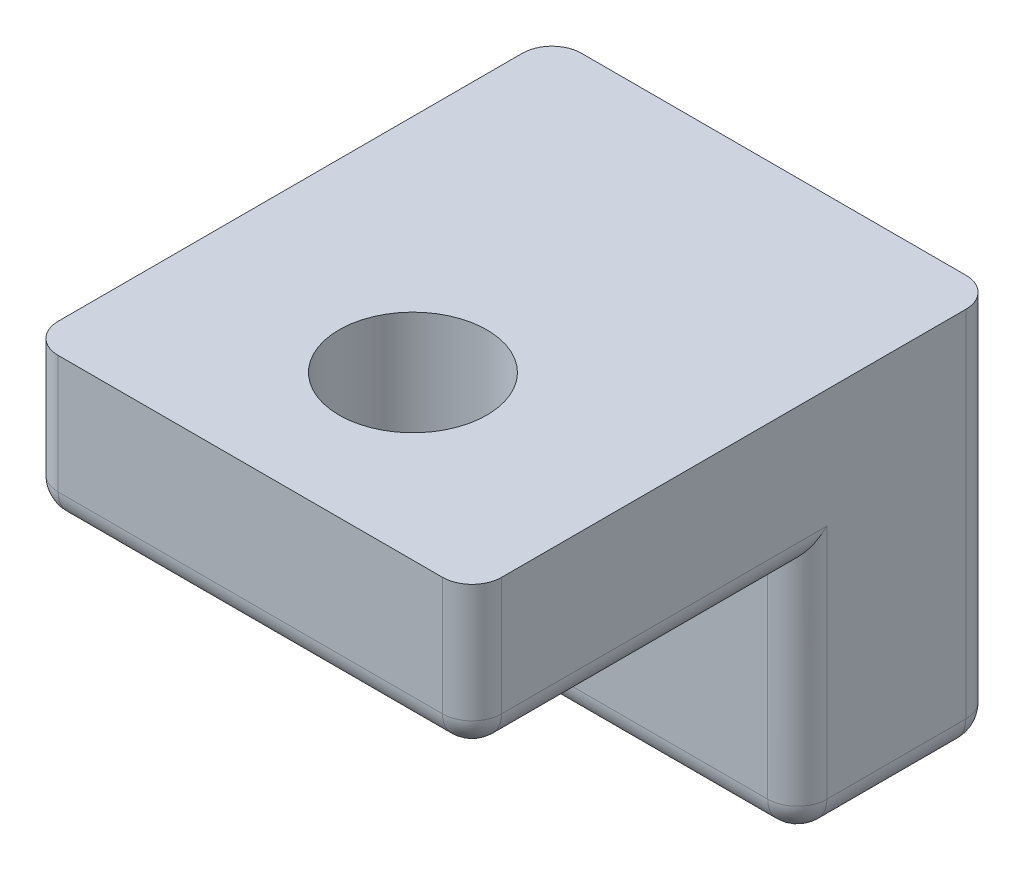
ISO-10303-21;
HEADER;
FILE_DESCRIPTION(('STEP AP214'),'2;1');
FILE_NAME('part.step','',(''),(''),'','','');
FILE_SCHEMA(('AUTOMOTIVE_DESIGN { 1 0 10303 214 1 1 1 1 }'));
ENDSEC;
DATA;
#1=APPLICATION_CONTEXT('core data for automotive mechanical design processes');
#2=APPLICATION_PROTOCOL_DEFINITION('international standard','automotive_design',2000,#1);
#3=PRODUCT_CONTEXT('',#1,'mechanical');
#4=PRODUCT('Part','Part','',(#3));
#5=PRODUCT_RELATED_PRODUCT_CATEGORY('part','',(#4));
#6=PRODUCT_DEFINITION_FORMATION('','',#4);
#7=PRODUCT_DEFINITION_CONTEXT('part definition',#1,'design');
#8=PRODUCT_DEFINITION('design','',#6,#7);
#9=PRODUCT_DEFINITION_SHAPE('','',#8);
#10=(LENGTH_UNIT() NAMED_UNIT(*) SI_UNIT(.MILLI.,.METRE.));
#11=(NAMED_UNIT(*) PLANE_ANGLE_UNIT() SI_UNIT($,.RADIAN.));
#12=(NAMED_UNIT(*) SI_UNIT($,.STERADIAN.) SOLID_ANGLE_UNIT());
#13=UNCERTAINTY_MEASURE_WITH_UNIT(LENGTH_MEASURE(1.E-05),#10,'distance_accuracy_value','');
#14=(GEOMETRIC_REPRESENTATION_CONTEXT(3) GLOBAL_UNCERTAINTY_ASSIGNED_CONTEXT((#13)) GLOBAL_UNIT_ASSIGNED_CONTEXT((#10,
#11,#12)) REPRESENTATION_CONTEXT('',''));
#15=CARTESIAN_POINT('',(0.,0.,0.));
#16=DIRECTION('',(0.,0.,1.));
#17=DIRECTION('',(1.,0.,0.));
#18=AXIS2_PLACEMENT_3D('',#15,#16,#17);
#19=CARTESIAN_POINT('',(7.5,0.,-6.70000000000001));
#20=DIRECTION('',(0.,1.,0.));
#21=DIRECTION('',(0.,0.,1.));
#22=AXIS2_PLACEMENT_3D('',#19,#20,#21);
#23=PLANE('',#22);
#24=DIRECTION('',(0.,0.,-1.));
#25=VECTOR('',#24,1.);
#26=CARTESIAN_POINT('',(6.5,0.,-6.70000000000001));
#27=LINE('',#26,#25);
#28=CARTESIAN_POINT('',(6.5,0.,-5.70000000000001));
#29=VERTEX_POINT('',#28);
#30=CARTESIAN_POINT('',(6.5,0.,-0.999999999999997));
#31=VERTEX_POINT('',#30);
#32=EDGE_CURVE('E183',#29,#31,#27,.F.);
#33=ORIENTED_EDGE('',*,*,#32,.T.);
#34=DIRECTION('',(-1.,0.,0.));
#35=VECTOR('',#34,1.);
#36=CARTESIAN_POINT('',(7.5,0.,-0.999999999999997));
#37=LINE('',#36,#35);
#38=CARTESIAN_POINT('',(-6.5,0.,-0.999999999999997));
#39=VERTEX_POINT('',#38);
#40=EDGE_CURVE('E152',#31,#39,#37,.T.);
#41=ORIENTED_EDGE('',*,*,#40,.T.);
#42=DIRECTION('',(0.,0.,-1.));
#43=VECTOR('',#42,1.);
#44=CARTESIAN_POINT('',(-6.5,0.,-6.70000000000001));
#45=LINE('',#44,#43);
#46=CARTESIAN_POINT('',(-6.5,0.,-5.70000000000001));
#47=VERTEX_POINT('',#46);
#48=EDGE_CURVE('E172',#39,#47,#45,.T.);
#49=ORIENTED_EDGE('',*,*,#48,.T.);
#50=DIRECTION('',(-1.,0.,0.));
#51=VECTOR('',#50,1.);
#52=CARTESIAN_POINT('',(7.5,0.,-5.70000000000001));
#53=LINE('',#52,#51);
#54=EDGE_CURVE('E179',#47,#29,#53,.F.);
#55=ORIENTED_EDGE('',*,*,#54,.T.);
#56=EDGE_LOOP('',(#33,#41,#49,#55));
#57=FACE_BOUND('',#56,.T.);
#58=ADVANCED_FACE('F39',(#57),#23,.F.);
#59=CARTESIAN_POINT('',(7.5,13.,-6.7));
#60=DIRECTION('',(0.,0.,1.));
#61=DIRECTION('',(0.,-1.,0.));
#62=AXIS2_PLACEMENT_3D('',#59,#60,#61);
#63=PLANE('',#62);
#64=DIRECTION('',(-1.,0.,0.));
#65=VECTOR('',#64,1.);
#66=CARTESIAN_POINT('',(7.5,0.999999999999984,-6.70000000000001));
#67=LINE('',#66,#65);
#68=CARTESIAN_POINT('',(6.5,0.999999999999984,-6.70000000000001));
#69=VERTEX_POINT('',#68);
#70=CARTESIAN_POINT('',(-6.5,0.999999999999984,-6.70000000000001));
#71=VERTEX_POINT('',#70);
#72=EDGE_CURVE('E218',#69,#71,#67,.T.);
#73=ORIENTED_EDGE('',*,*,#72,.T.);
#74=DIRECTION('',(0.,1.,0.));
#75=VECTOR('',#74,1.);
#76=CARTESIAN_POINT('',(-6.5,13.,-6.7));
#77=LINE('',#76,#75);
#78=CARTESIAN_POINT('',(-6.5,13.,-6.7));
#79=VERTEX_POINT('',#78);
#80=EDGE_CURVE('E221',#71,#79,#77,.T.);
#81=ORIENTED_EDGE('',*,*,#80,.T.);
#82=DIRECTION('',(-1.,0.,0.));
#83=VECTOR('',#82,1.);
#84=CARTESIAN_POINT('',(7.5,13.,-6.7));
#85=LINE('',#84,#83);
#86=CARTESIAN_POINT('',(6.5,13.,-6.7));
#87=VERTEX_POINT('',#86);
#88=EDGE_CURVE('E180',#87,#79,#85,.T.);
#89=ORIENTED_EDGE('',*,*,#88,.F.);
#90=DIRECTION('',(0.,1.,0.));
#91=VECTOR('',#90,1.);
#92=CARTESIAN_POINT('',(6.5,13.,-6.7));
#93=LINE('',#92,#91);
#94=EDGE_CURVE('E215',#87,#69,#93,.F.);
#95=ORIENTED_EDGE('',*,*,#94,.T.);
#96=EDGE_LOOP('',(#73,#81,#89,#95));
#97=FACE_BOUND('',#96,.T.);
#98=ADVANCED_FACE('F424',(#97),#63,.F.);
#99=CARTESIAN_POINT('',(7.5,13.,11.));
#100=DIRECTION('',(0.,-1.,0.));
#101=DIRECTION('',(0.,0.,-1.));
#102=AXIS2_PLACEMENT_3D('',#99,#100,#101);
#103=PLANE('',#102);
#104=CARTESIAN_POINT('',(0.,13.,5.50000000000001));
#105=DIRECTION('',(0.,1.,0.));
#106=DIRECTION('',(0.,0.,1.));
#107=AXIS2_PLACEMENT_3D('',#104,#105,#106);
#108=CIRCLE('',#107,2.5);
#109=CARTESIAN_POINT('',(0.,13.,8.00000000000001));
#110=VERTEX_POINT('',#109);
#111=EDGE_CURVE('E326',#110,#110,#108,.T.);
#112=ORIENTED_EDGE('',*,*,#111,.F.);
#113=EDGE_LOOP('',(#112));
#114=FACE_BOUND('',#113,.T.);
#115=ORIENTED_EDGE('',*,*,#88,.T.);
#116=CARTESIAN_POINT('',(-6.5,13.,-5.7));
#117=DIRECTION('',(0.,-1.,0.));
#118=DIRECTION('',(0.,0.,-1.));
#119=AXIS2_PLACEMENT_3D('',#116,#117,#118);
#120=CIRCLE('',#119,1.);
#121=CARTESIAN_POINT('',(-7.5,13.,-5.7));
#122=VERTEX_POINT('',#121);
#123=EDGE_CURVE('E11',#79,#122,#120,.F.);
#124=ORIENTED_EDGE('',*,*,#123,.T.);
#125=DIRECTION('',(0.,0.,1.));
#126=VECTOR('',#125,1.);
#127=CARTESIAN_POINT('',(-7.5,13.,11.));
#128=LINE('',#127,#126);
#129=CARTESIAN_POINT('',(-7.5,13.,10.));
#130=VERTEX_POINT('',#129);
#131=EDGE_CURVE('E336',#122,#130,#128,.T.);
#132=ORIENTED_EDGE('',*,*,#131,.T.);
#133=CARTESIAN_POINT('',(-6.5,13.,10.));
#134=DIRECTION('',(0.,-1.,0.));
#135=DIRECTION('',(0.,0.,-1.));
#136=AXIS2_PLACEMENT_3D('',#133,#134,#135);
#137=CIRCLE('',#136,1.);
#138=CARTESIAN_POINT('',(-6.5,13.,11.));
#139=VERTEX_POINT('',#138);
#140=EDGE_CURVE('E49',#130,#139,#137,.F.);
#141=ORIENTED_EDGE('',*,*,#140,.T.);
#142=DIRECTION('',(-1.,0.,0.));
#143=VECTOR('',#142,1.);
#144=CARTESIAN_POINT('',(7.5,13.,11.));
#145=LINE('',#144,#143);
#146=CARTESIAN_POINT('',(6.5,13.,11.));
#147=VERTEX_POINT('',#146);
#148=EDGE_CURVE('E350',#147,#139,#145,.T.);
#149=ORIENTED_EDGE('',*,*,#148,.F.);
#150=CARTESIAN_POINT('',(6.5,13.,10.));
#151=DIRECTION('',(0.,-1.,0.));
#152=DIRECTION('',(0.,0.,-1.));
#153=AXIS2_PLACEMENT_3D('',#150,#151,#152);
#154=CIRCLE('',#153,1.);
#155=CARTESIAN_POINT('',(7.5,13.,10.));
#156=VERTEX_POINT('',#155);
#157=EDGE_CURVE('E258',#147,#156,#154,.F.);
#158=ORIENTED_EDGE('',*,*,#157,.T.);
#159=DIRECTION('',(0.,0.,1.));
#160=VECTOR('',#159,1.);
#161=CARTESIAN_POINT('',(7.5,13.,11.));
#162=LINE('',#161,#160);
#163=CARTESIAN_POINT('',(7.5,13.,-5.7));
#164=VERTEX_POINT('',#163);
#165=EDGE_CURVE('E339',#164,#156,#162,.T.);
#166=ORIENTED_EDGE('',*,*,#165,.F.);
#167=CARTESIAN_POINT('',(6.5,13.,-5.7));
#168=DIRECTION('',(0.,-1.,0.));
#169=DIRECTION('',(0.,0.,-1.));
#170=AXIS2_PLACEMENT_3D('',#167,#168,#169);
#171=CIRCLE('',#170,1.);
#172=EDGE_CURVE('E255',#164,#87,#171,.F.);
#173=ORIENTED_EDGE('',*,*,#172,.T.);
#174=EDGE_LOOP('',(#115,#124,#132,#141,#149,#158,#166,#173));
#175=FACE_BOUND('',#174,.T.);
#176=ADVANCED_FACE('F404',(#114,#175),#103,.F.);
#177=CARTESIAN_POINT('',(7.5,8.00000000000001,10.9999999999999));
#178=DIRECTION('',(0.,0.,-1.));
#179=DIRECTION('',(0.,1.,0.));
#180=AXIS2_PLACEMENT_3D('',#177,#178,#179);
#181=PLANE('',#180);
#182=ORIENTED_EDGE('',*,*,#148,.T.);
#183=DIRECTION('',(0.,-1.,0.));
#184=VECTOR('',#183,1.);
#185=CARTESIAN_POINT('',(-6.5,8.00000000000001,10.9999999999999));
#186=LINE('',#185,#184);
#187=CARTESIAN_POINT('',(-6.5,8.99999999999999,10.9999999999999));
#188=VERTEX_POINT('',#187);
#189=EDGE_CURVE('E57',#139,#188,#186,.T.);
#190=ORIENTED_EDGE('',*,*,#189,.T.);
#191=DIRECTION('',(-1.,0.,0.));
#192=VECTOR('',#191,1.);
#193=CARTESIAN_POINT('',(7.5,8.99999999999999,10.9999999999999));
#194=LINE('',#193,#192);
#195=CARTESIAN_POINT('',(6.5,8.99999999999999,10.9999999999999));
#196=VERTEX_POINT('',#195);
#197=EDGE_CURVE('E61',#188,#196,#194,.F.);
#198=ORIENTED_EDGE('',*,*,#197,.T.);
#199=DIRECTION('',(0.,-1.,0.));
#200=VECTOR('',#199,1.);
#201=CARTESIAN_POINT('',(6.5,8.00000000000001,10.9999999999999));
#202=LINE('',#201,#200);
#203=EDGE_CURVE('E248',#196,#147,#202,.F.);
#204=ORIENTED_EDGE('',*,*,#203,.T.);
#205=EDGE_LOOP('',(#182,#190,#198,#204));
#206=FACE_BOUND('',#205,.T.);
#207=ADVANCED_FACE('F609',(#206),#181,.F.);
#208=CARTESIAN_POINT('',(7.5,8.00000000000001,0.));
#209=DIRECTION('',(0.,1.,0.));
#210=DIRECTION('',(0.,0.,1.));
#211=AXIS2_PLACEMENT_3D('',#208,#209,#210);
#212=PLANE('',#211);
#213=CARTESIAN_POINT('',(0.,8.00000000000001,5.50000000000001));
#214=DIRECTION('',(0.,1.,0.));
#215=DIRECTION('',(0.,0.,1.));
#216=AXIS2_PLACEMENT_3D('',#213,#214,#215);
#217=CIRCLE('',#216,2.5);
#218=CARTESIAN_POINT('',(0.,8.00000000000001,8.00000000000001));
#219=VERTEX_POINT('',#218);
#220=EDGE_CURVE('E330',#219,#219,#217,.F.);
#221=ORIENTED_EDGE('',*,*,#220,.F.);
#222=EDGE_LOOP('',(#221));
#223=FACE_BOUND('',#222,.T.);
#224=DIRECTION('',(-1.,0.,0.));
#225=VECTOR('',#224,1.);
#226=CARTESIAN_POINT('',(7.5,8.00000000000001,9.99999999999994));
#227=LINE('',#226,#225);
#228=CARTESIAN_POINT('',(6.5,8.00000000000001,9.99999999999994));
#229=VERTEX_POINT('',#228);
#230=CARTESIAN_POINT('',(-6.5,8.00000000000001,9.99999999999994));
#231=VERTEX_POINT('',#230);
#232=EDGE_CURVE('E242',#229,#231,#227,.T.);
#233=ORIENTED_EDGE('',*,*,#232,.T.);
#234=DIRECTION('',(0.,0.,-1.));
#235=VECTOR('',#234,1.);
#236=CARTESIAN_POINT('',(-6.5,8.00000000000001,0.));
#237=LINE('',#236,#235);
#238=CARTESIAN_POINT('',(-6.5,8.00000000000001,0.));
#239=VERTEX_POINT('',#238);
#240=EDGE_CURVE('E245',#231,#239,#237,.T.);
#241=ORIENTED_EDGE('',*,*,#240,.T.);
#242=DIRECTION('',(-1.,0.,0.));
#243=VECTOR('',#242,1.);
#244=CARTESIAN_POINT('',(7.5,8.00000000000001,0.));
#245=LINE('',#244,#243);
#246=CARTESIAN_POINT('',(6.5,8.00000000000001,0.));
#247=VERTEX_POINT('',#246);
#248=EDGE_CURVE('E343',#247,#239,#245,.T.);
#249=ORIENTED_EDGE('',*,*,#248,.F.);
#250=DIRECTION('',(0.,0.,-1.));
#251=VECTOR('',#250,1.);
#252=CARTESIAN_POINT('',(6.5,8.00000000000001,0.));
#253=LINE('',#252,#251);
#254=EDGE_CURVE('E239',#247,#229,#253,.F.);
#255=ORIENTED_EDGE('',*,*,#254,.T.);
#256=EDGE_LOOP('',(#233,#241,#249,#255));
#257=FACE_BOUND('',#256,.T.);
#258=ADVANCED_FACE('F601',(#223,#257),#212,.F.);
#259=CARTESIAN_POINT('',(7.5,0.,0.));
#260=DIRECTION('',(0.,0.,-1.));
#261=DIRECTION('',(0.,1.,0.));
#262=AXIS2_PLACEMENT_3D('',#259,#260,#261);
#263=PLANE('',#262);
#264=DIRECTION('',(-1.,0.,0.));
#265=VECTOR('',#264,1.);
#266=CARTESIAN_POINT('',(7.5,0.999999999999997,0.));
#267=LINE('',#266,#265);
#268=CARTESIAN_POINT('',(-6.5,0.999999999999997,0.));
#269=VERTEX_POINT('',#268);
#270=CARTESIAN_POINT('',(6.5,0.999999999999997,0.));
#271=VERTEX_POINT('',#270);
#272=EDGE_CURVE('E154',#269,#271,#267,.F.);
#273=ORIENTED_EDGE('',*,*,#272,.T.);
#274=DIRECTION('',(0.,-1.,0.));
#275=VECTOR('',#274,1.);
#276=CARTESIAN_POINT('',(6.5,0.,0.));
#277=LINE('',#276,#275);
#278=EDGE_CURVE('E196',#271,#247,#277,.F.);
#279=ORIENTED_EDGE('',*,*,#278,.T.);
#280=ORIENTED_EDGE('',*,*,#248,.T.);
#281=DIRECTION('',(0.,-1.,0.));
#282=VECTOR('',#281,1.);
#283=CARTESIAN_POINT('',(-6.5,0.,0.));
#284=LINE('',#283,#282);
#285=EDGE_CURVE('E186',#239,#269,#284,.T.);
#286=ORIENTED_EDGE('',*,*,#285,.T.);
#287=EDGE_LOOP('',(#273,#279,#280,#286));
#288=FACE_BOUND('',#287,.T.);
#289=ADVANCED_FACE('F380',(#288),#263,.F.);
#290=CARTESIAN_POINT('',(7.5,0.,0.));
#291=DIRECTION('',(-1.,0.,0.));
#292=DIRECTION('',(0.,0.,1.));
#293=AXIS2_PLACEMENT_3D('',#290,#291,#292);
#294=PLANE('',#293);
#295=ORIENTED_EDGE('',*,*,#165,.T.);
#296=DIRECTION('',(0.,-1.,0.));
#297=VECTOR('',#296,1.);
#298=CARTESIAN_POINT('',(7.5,-1.45716771982049E-13,9.99999999999981));
#299=LINE('',#298,#297);
#300=CARTESIAN_POINT('',(7.5,9.00000000000001,9.99999999999994));
#301=VERTEX_POINT('',#300);
#302=EDGE_CURVE('E212',#156,#301,#299,.T.);
#303=ORIENTED_EDGE('',*,*,#302,.T.);
#304=DIRECTION('',(0.,0.,-1.));
#305=VECTOR('',#304,1.);
#306=CARTESIAN_POINT('',(7.5,9.00000000000001,0.));
#307=LINE('',#306,#305);
#308=CARTESIAN_POINT('',(7.5,9.00000000000001,-0.999999999999997));
#309=VERTEX_POINT('',#308);
#310=EDGE_CURVE('E209',#301,#309,#307,.T.);
#311=ORIENTED_EDGE('',*,*,#310,.T.);
#312=DIRECTION('',(0.,-1.,0.));
#313=VECTOR('',#312,1.);
#314=CARTESIAN_POINT('',(7.5,0.,-1.));
#315=LINE('',#314,#313);
#316=CARTESIAN_POINT('',(7.5,0.999999999999997,-1.));
#317=VERTEX_POINT('',#316);
#318=EDGE_CURVE('E206',#309,#317,#315,.T.);
#319=ORIENTED_EDGE('',*,*,#318,.T.);
#320=DIRECTION('',(0.,0.,-1.));
#321=VECTOR('',#320,1.);
#322=CARTESIAN_POINT('',(7.5,1.,0.));
#323=LINE('',#322,#321);
#324=CARTESIAN_POINT('',(7.5,0.999999999999983,-5.70000000000001));
#325=VERTEX_POINT('',#324);
#326=EDGE_CURVE('E202',#317,#325,#323,.T.);
#327=ORIENTED_EDGE('',*,*,#326,.T.);
#328=DIRECTION('',(0.,1.,0.));
#329=VECTOR('',#328,1.);
#330=CARTESIAN_POINT('',(7.5,0.,-5.70000000000001));
#331=LINE('',#330,#329);
#332=EDGE_CURVE('E199',#325,#164,#331,.T.);
#333=ORIENTED_EDGE('',*,*,#332,.T.);
#334=EDGE_LOOP('',(#295,#303,#311,#319,#327,#333));
#335=FACE_BOUND('',#334,.T.);
#336=ADVANCED_FACE('F585',(#335),#294,.F.);
#337=CARTESIAN_POINT('',(-7.5,0.,0.));
#338=DIRECTION('',(-1.,0.,0.));
#339=DIRECTION('',(0.,0.,1.));
#340=AXIS2_PLACEMENT_3D('',#337,#338,#339);
#341=PLANE('',#340);
#342=ORIENTED_EDGE('',*,*,#131,.F.);
#343=DIRECTION('',(0.,1.,0.));
#344=VECTOR('',#343,1.);
#345=CARTESIAN_POINT('',(-7.5,0.,-5.70000000000001));
#346=LINE('',#345,#344);
#347=CARTESIAN_POINT('',(-7.5,0.999999999999983,-5.70000000000001));
#348=VERTEX_POINT('',#347);
#349=EDGE_CURVE('E236',#122,#348,#346,.F.);
#350=ORIENTED_EDGE('',*,*,#349,.T.);
#351=DIRECTION('',(0.,0.,-1.));
#352=VECTOR('',#351,1.);
#353=CARTESIAN_POINT('',(-7.5,1.,0.));
#354=LINE('',#353,#352);
#355=CARTESIAN_POINT('',(-7.5,0.999999999999997,-1.));
#356=VERTEX_POINT('',#355);
#357=EDGE_CURVE('E233',#348,#356,#354,.F.);
#358=ORIENTED_EDGE('',*,*,#357,.T.);
#359=DIRECTION('',(0.,-1.,0.));
#360=VECTOR('',#359,1.);
#361=CARTESIAN_POINT('',(-7.5,8.00000000000001,-0.999999999999998));
#362=LINE('',#361,#360);
#363=CARTESIAN_POINT('',(-7.5,9.00000000000001,-0.999999999999997));
#364=VERTEX_POINT('',#363);
#365=EDGE_CURVE('E230',#356,#364,#362,.F.);
#366=ORIENTED_EDGE('',*,*,#365,.T.);
#367=DIRECTION('',(0.,0.,-1.));
#368=VECTOR('',#367,1.);
#369=CARTESIAN_POINT('',(-7.5,9.00000000000001,10.9999999999999));
#370=LINE('',#369,#368);
#371=CARTESIAN_POINT('',(-7.5,9.00000000000001,9.99999999999994));
#372=VERTEX_POINT('',#371);
#373=EDGE_CURVE('E227',#364,#372,#370,.F.);
#374=ORIENTED_EDGE('',*,*,#373,.T.);
#375=DIRECTION('',(0.,-1.,0.));
#376=VECTOR('',#375,1.);
#377=CARTESIAN_POINT('',(-7.5,13.,10.));
#378=LINE('',#377,#376);
#379=EDGE_CURVE('E224',#372,#130,#378,.F.);
#380=ORIENTED_EDGE('',*,*,#379,.T.);
#381=EDGE_LOOP('',(#342,#350,#358,#366,#374,#380));
#382=FACE_BOUND('',#381,.T.);
#383=ADVANCED_FACE('F389',(#382),#341,.T.);
#384=CARTESIAN_POINT('',(0.,-0.00100000000002008,5.50000000000001));
#385=DIRECTION('',(0.,1.,0.));
#386=DIRECTION('',(0.,0.,1.));
#387=AXIS2_PLACEMENT_3D('',#384,#385,#386);
#388=CYLINDRICAL_SURFACE('',#387,2.5);
#389=ORIENTED_EDGE('',*,*,#111,.T.);
#390=EDGE_LOOP('',(#389));
#391=FACE_BOUND('',#390,.T.);
#392=ORIENTED_EDGE('',*,*,#220,.T.);
#393=EDGE_LOOP('',(#392));
#394=FACE_BOUND('',#393,.T.);
#395=ADVANCED_FACE('F570',(#391,#394),#388,.F.);
#396=CARTESIAN_POINT('',(6.5,-1.45716771982049E-13,9.99999999999981));
#397=DIRECTION('',(0.,-1.,0.));
#398=DIRECTION('',(0.,0.,-1.));
#399=AXIS2_PLACEMENT_3D('',#396,#397,#398);
#400=CYLINDRICAL_SURFACE('',#399,1.);
#401=ORIENTED_EDGE('',*,*,#157,.F.);
#402=ORIENTED_EDGE('',*,*,#203,.F.);
#403=CARTESIAN_POINT('',(6.5,9.00000000000001,9.99999999999994));
#404=DIRECTION('',(0.,-1.,0.));
#405=DIRECTION('',(0.,0.,-1.));
#406=AXIS2_PLACEMENT_3D('',#403,#404,#405);
#407=CIRCLE('',#406,1.);
#408=EDGE_CURVE('E318',#301,#196,#407,.T.);
#409=ORIENTED_EDGE('',*,*,#408,.F.);
#410=ORIENTED_EDGE('',*,*,#302,.F.);
#411=EDGE_LOOP('',(#401,#402,#409,#410));
#412=FACE_BOUND('',#411,.T.);
#413=ADVANCED_FACE('F41',(#412),#400,.T.);
#414=CARTESIAN_POINT('',(-6.5,8.00000000000002,9.99999999999993));
#415=DIRECTION('',(0.,1.,0.));
#416=DIRECTION('',(0.,0.,1.));
#417=AXIS2_PLACEMENT_3D('',#414,#415,#416);
#418=CYLINDRICAL_SURFACE('',#417,1.);
#419=ORIENTED_EDGE('',*,*,#140,.F.);
#420=ORIENTED_EDGE('',*,*,#379,.F.);
#421=CARTESIAN_POINT('',(-6.5,9.00000000000001,9.99999999999994));
#422=DIRECTION('',(0.,-1.,0.));
#423=DIRECTION('',(0.,0.,-1.));
#424=AXIS2_PLACEMENT_3D('',#421,#422,#423);
#425=CIRCLE('',#424,1.);
#426=EDGE_CURVE('E315',#188,#372,#425,.T.);
#427=ORIENTED_EDGE('',*,*,#426,.F.);
#428=ORIENTED_EDGE('',*,*,#189,.F.);
#429=EDGE_LOOP('',(#419,#420,#427,#428));
#430=FACE_BOUND('',#429,.T.);
#431=ADVANCED_FACE('F401',(#430),#418,.T.);
#432=CARTESIAN_POINT('',(7.5,9.00000000000001,9.99999999999994));
#433=DIRECTION('',(-1.,0.,0.));
#434=DIRECTION('',(0.,0.,1.));
#435=AXIS2_PLACEMENT_3D('',#432,#433,#434);
#436=CYLINDRICAL_SURFACE('',#435,1.);
#437=CARTESIAN_POINT('',(6.5,9.00000000000001,9.99999999999994));
#438=DIRECTION('',(1.,0.,0.));
#439=DIRECTION('',(0.,0.,-1.));
#440=AXIS2_PLACEMENT_3D('',#437,#438,#439);
#441=CIRCLE('',#440,1.);
#442=EDGE_CURVE('E43',#196,#229,#441,.T.);
#443=ORIENTED_EDGE('',*,*,#442,.F.);
#444=ORIENTED_EDGE('',*,*,#197,.F.);
#445=CARTESIAN_POINT('',(-6.5,9.00000000000001,9.99999999999994));
#446=DIRECTION('',(-1.,0.,0.));
#447=DIRECTION('',(0.,0.,1.));
#448=AXIS2_PLACEMENT_3D('',#445,#446,#447);
#449=CIRCLE('',#448,1.);
#450=EDGE_CURVE('E311',#231,#188,#449,.T.);
#451=ORIENTED_EDGE('',*,*,#450,.F.);
#452=ORIENTED_EDGE('',*,*,#232,.F.);
#453=EDGE_LOOP('',(#443,#444,#451,#452));
#454=FACE_BOUND('',#453,.T.);
#455=ADVANCED_FACE('F548',(#454),#436,.T.);
#456=CARTESIAN_POINT('',(6.5,9.00000000000001,9.99999999999994));
#457=DIRECTION('',(0.,0.,1.));
#458=DIRECTION('',(0.,-1.,0.));
#459=AXIS2_PLACEMENT_3D('',#456,#457,#458);
#460=SPHERICAL_SURFACE('',#459,1.);
#461=ORIENTED_EDGE('',*,*,#408,.T.);
#462=ORIENTED_EDGE('',*,*,#442,.T.);
#463=CARTESIAN_POINT('',(6.5,9.00000000000001,9.99999999999994));
#464=DIRECTION('',(0.,0.,1.));
#465=DIRECTION('',(1.,0.,0.));
#466=AXIS2_PLACEMENT_3D('',#463,#464,#465);
#467=CIRCLE('',#466,1.);
#468=EDGE_CURVE('E307',#301,#229,#467,.F.);
#469=ORIENTED_EDGE('',*,*,#468,.F.);
#470=EDGE_LOOP('',(#461,#462,#469));
#471=FACE_BOUND('',#470,.T.);
#472=ADVANCED_FACE('F539',(#471),#460,.T.);
#473=CARTESIAN_POINT('',(6.5,0.,-5.70000000000001));
#474=DIRECTION('',(0.,1.,0.));
#475=DIRECTION('',(0.,0.,1.));
#476=AXIS2_PLACEMENT_3D('',#473,#474,#475);
#477=CYLINDRICAL_SURFACE('',#476,1.);
#478=ORIENTED_EDGE('',*,*,#172,.F.);
#479=ORIENTED_EDGE('',*,*,#332,.F.);
#480=CARTESIAN_POINT('',(6.5,0.999999999999984,-5.70000000000001));
#481=DIRECTION('',(0.,-1.,0.));
#482=DIRECTION('',(0.,0.,-1.));
#483=AXIS2_PLACEMENT_3D('',#480,#481,#482);
#484=CIRCLE('',#483,1.);
#485=EDGE_CURVE('E303',#69,#325,#484,.T.);
#486=ORIENTED_EDGE('',*,*,#485,.F.);
#487=ORIENTED_EDGE('',*,*,#94,.F.);
#488=EDGE_LOOP('',(#478,#479,#486,#487));
#489=FACE_BOUND('',#488,.T.);
#490=ADVANCED_FACE('F531',(#489),#477,.T.);
#491=CARTESIAN_POINT('',(7.5,0.999999999999984,-5.70000000000001));
#492=DIRECTION('',(-1.,0.,0.));
#493=DIRECTION('',(0.,0.,1.));
#494=AXIS2_PLACEMENT_3D('',#491,#492,#493);
#495=CYLINDRICAL_SURFACE('',#494,1.);
#496=CARTESIAN_POINT('',(-6.5,0.999999999999984,-5.70000000000001));
#497=DIRECTION('',(-1.,0.,0.));
#498=DIRECTION('',(0.,0.,1.));
#499=AXIS2_PLACEMENT_3D('',#496,#497,#498);
#500=CIRCLE('',#499,1.);
#501=EDGE_CURVE('E295',#71,#47,#500,.T.);
#502=ORIENTED_EDGE('',*,*,#501,.F.);
#503=ORIENTED_EDGE('',*,*,#72,.F.);
#504=CARTESIAN_POINT('',(6.5,0.999999999999983,-5.70000000000001));
#505=DIRECTION('',(1.,0.,0.));
#506=DIRECTION('',(0.,0.,-1.));
#507=AXIS2_PLACEMENT_3D('',#504,#505,#506);
#508=CIRCLE('',#507,1.);
#509=EDGE_CURVE('E299',#29,#69,#508,.T.);
#510=ORIENTED_EDGE('',*,*,#509,.F.);
#511=ORIENTED_EDGE('',*,*,#54,.F.);
#512=EDGE_LOOP('',(#502,#503,#510,#511));
#513=FACE_BOUND('',#512,.T.);
#514=ADVANCED_FACE('F361',(#513),#495,.T.);
#515=CARTESIAN_POINT('',(-6.5,13.,-5.7));
#516=DIRECTION('',(0.,-1.,0.));
#517=DIRECTION('',(0.,0.,-1.));
#518=AXIS2_PLACEMENT_3D('',#515,#516,#517);
#519=CYLINDRICAL_SURFACE('',#518,1.);
#520=ORIENTED_EDGE('',*,*,#123,.F.);
#521=ORIENTED_EDGE('',*,*,#80,.F.);
#522=CARTESIAN_POINT('',(-6.5,0.999999999999983,-5.70000000000001));
#523=DIRECTION('',(0.,-1.,0.));
#524=DIRECTION('',(0.,0.,-1.));
#525=AXIS2_PLACEMENT_3D('',#522,#523,#524);
#526=CIRCLE('',#525,1.);
#527=EDGE_CURVE('E291',#348,#71,#526,.T.);
#528=ORIENTED_EDGE('',*,*,#527,.F.);
#529=ORIENTED_EDGE('',*,*,#349,.F.);
#530=EDGE_LOOP('',(#520,#521,#528,#529));
#531=FACE_BOUND('',#530,.T.);
#532=ADVANCED_FACE('F410',(#531),#519,.T.);
#533=CARTESIAN_POINT('',(-6.5,9.00000000000001,9.99999999999994));
#534=DIRECTION('',(0.,0.,1.));
#535=DIRECTION('',(0.,-1.,0.));
#536=AXIS2_PLACEMENT_3D('',#533,#534,#535);
#537=SPHERICAL_SURFACE('',#536,1.);
#538=ORIENTED_EDGE('',*,*,#450,.T.);
#539=ORIENTED_EDGE('',*,*,#426,.T.);
#540=CARTESIAN_POINT('',(-6.5,9.00000000000001,9.99999999999994));
#541=DIRECTION('',(0.,0.,1.));
#542=DIRECTION('',(1.,0.,0.));
#543=AXIS2_PLACEMENT_3D('',#540,#541,#542);
#544=CIRCLE('',#543,1.);
#545=EDGE_CURVE('E287',#231,#372,#544,.F.);
#546=ORIENTED_EDGE('',*,*,#545,.F.);
#547=EDGE_LOOP('',(#538,#539,#546));
#548=FACE_BOUND('',#547,.T.);
#549=ADVANCED_FACE('F396',(#548),#537,.T.);
#550=CARTESIAN_POINT('',(6.5,9.00000000000001,0.));
#551=DIRECTION('',(0.,0.,-1.));
#552=DIRECTION('',(-1.,0.,0.));
#553=AXIS2_PLACEMENT_3D('',#550,#551,#552);
#554=CYLINDRICAL_SURFACE('',#553,1.);
#555=ORIENTED_EDGE('',*,*,#468,.T.);
#556=ORIENTED_EDGE('',*,*,#254,.F.);
#557=CARTESIAN_POINT('',(6.5,9.00000000000001,-0.999999999999997));
#558=DIRECTION('',(0.,-0.707106781186547,-0.707106781186548));
#559=DIRECTION('',(0.,0.707106781186548,-0.707106781186547));
#560=AXIS2_PLACEMENT_3D('',#557,#558,#559);
#561=ELLIPSE('',#560,1.41421356237309,1.);
#562=EDGE_CURVE('E283',#309,#247,#561,.T.);
#563=ORIENTED_EDGE('',*,*,#562,.F.);
#564=ORIENTED_EDGE('',*,*,#310,.F.);
#565=EDGE_LOOP('',(#555,#556,#563,#564));
#566=FACE_BOUND('',#565,.T.);
#567=ADVANCED_FACE('F421',(#566),#554,.T.);
#568=CARTESIAN_POINT('',(6.5,0.999999999999983,-5.70000000000001));
#569=DIRECTION('',(0.,0.,-1.));
#570=DIRECTION('',(0.,1.,0.));
#571=AXIS2_PLACEMENT_3D('',#568,#569,#570);
#572=SPHERICAL_SURFACE('',#571,1.);
#573=ORIENTED_EDGE('',*,*,#509,.T.);
#574=ORIENTED_EDGE('',*,*,#485,.T.);
#575=CARTESIAN_POINT('',(6.5,0.999999999999983,-5.70000000000001));
#576=DIRECTION('',(0.,0.,-1.));
#577=DIRECTION('',(0.,1.,0.));
#578=AXIS2_PLACEMENT_3D('',#575,#576,#577);
#579=CIRCLE('',#578,1.);
#580=EDGE_CURVE('E280',#29,#325,#579,.F.);
#581=ORIENTED_EDGE('',*,*,#580,.F.);
#582=EDGE_LOOP('',(#573,#574,#581));
#583=FACE_BOUND('',#582,.T.);
#584=ADVANCED_FACE('F364',(#583),#572,.T.);
#585=CARTESIAN_POINT('',(-6.5,0.999999999999983,-5.70000000000001));
#586=DIRECTION('',(0.,0.,-1.));
#587=DIRECTION('',(0.,1.,0.));
#588=AXIS2_PLACEMENT_3D('',#585,#586,#587);
#589=SPHERICAL_SURFACE('',#588,1.);
#590=ORIENTED_EDGE('',*,*,#527,.T.);
#591=ORIENTED_EDGE('',*,*,#501,.T.);
#592=CARTESIAN_POINT('',(-6.5,0.999999999999983,-5.70000000000001));
#593=DIRECTION('',(0.,0.,-1.));
#594=DIRECTION('',(0.,1.,0.));
#595=AXIS2_PLACEMENT_3D('',#592,#593,#594);
#596=CIRCLE('',#595,1.);
#597=EDGE_CURVE('E175',#348,#47,#596,.F.);
#598=ORIENTED_EDGE('',*,*,#597,.F.);
#599=EDGE_LOOP('',(#590,#591,#598));
#600=FACE_BOUND('',#599,.T.);
#601=ADVANCED_FACE('F413',(#600),#589,.T.);
#602=CARTESIAN_POINT('',(-6.5,9.00000000000001,0.));
#603=DIRECTION('',(0.,0.,1.));
#604=DIRECTION('',(1.,0.,0.));
#605=AXIS2_PLACEMENT_3D('',#602,#603,#604);
#606=CYLINDRICAL_SURFACE('',#605,1.);
#607=ORIENTED_EDGE('',*,*,#545,.T.);
#608=ORIENTED_EDGE('',*,*,#373,.F.);
#609=CARTESIAN_POINT('',(-6.5,9.00000000000001,-0.999999999999997));
#610=DIRECTION('',(0.,0.707106781186547,0.707106781186548));
#611=DIRECTION('',(0.,-0.707106781186548,0.707106781186547));
#612=AXIS2_PLACEMENT_3D('',#609,#610,#611);
#613=ELLIPSE('',#612,1.41421356237309,1.);
#614=EDGE_CURVE('E274',#239,#364,#613,.F.);
#615=ORIENTED_EDGE('',*,*,#614,.F.);
#616=ORIENTED_EDGE('',*,*,#240,.F.);
#617=EDGE_LOOP('',(#607,#608,#615,#616));
#618=FACE_BOUND('',#617,.T.);
#619=ADVANCED_FACE('F392',(#618),#606,.T.);
#620=CARTESIAN_POINT('',(6.5,0.,-1.));
#621=DIRECTION('',(0.,-1.,0.));
#622=DIRECTION('',(0.,0.,-1.));
#623=AXIS2_PLACEMENT_3D('',#620,#621,#622);
#624=CYLINDRICAL_SURFACE('',#623,1.);
#625=ORIENTED_EDGE('',*,*,#562,.T.);
#626=ORIENTED_EDGE('',*,*,#278,.F.);
#627=CARTESIAN_POINT('',(6.5,0.999999999999997,-1.));
#628=DIRECTION('',(0.,-1.,0.));
#629=DIRECTION('',(0.,0.,-1.));
#630=AXIS2_PLACEMENT_3D('',#627,#628,#629);
#631=CIRCLE('',#630,1.);
#632=EDGE_CURVE('E270',#317,#271,#631,.T.);
#633=ORIENTED_EDGE('',*,*,#632,.F.);
#634=ORIENTED_EDGE('',*,*,#318,.F.);
#635=EDGE_LOOP('',(#625,#626,#633,#634));
#636=FACE_BOUND('',#635,.T.);
#637=ADVANCED_FACE('F376',(#636),#624,.T.);
#638=CARTESIAN_POINT('',(6.5,1.,0.));
#639=DIRECTION('',(0.,0.,-1.));
#640=DIRECTION('',(0.,1.,0.));
#641=AXIS2_PLACEMENT_3D('',#638,#639,#640);
#642=CYLINDRICAL_SURFACE('',#641,1.);
#643=ORIENTED_EDGE('',*,*,#580,.T.);
#644=ORIENTED_EDGE('',*,*,#326,.F.);
#645=CARTESIAN_POINT('',(6.5,0.999999999999997,-1.));
#646=DIRECTION('',(0.,0.,1.));
#647=DIRECTION('',(0.,-1.,0.));
#648=AXIS2_PLACEMENT_3D('',#645,#646,#647);
#649=CIRCLE('',#648,1.);
#650=EDGE_CURVE('E169',#31,#317,#649,.T.);
#651=ORIENTED_EDGE('',*,*,#650,.F.);
#652=ORIENTED_EDGE('',*,*,#32,.F.);
#653=EDGE_LOOP('',(#643,#644,#651,#652));
#654=FACE_BOUND('',#653,.T.);
#655=ADVANCED_FACE('F368',(#654),#642,.T.);
#656=CARTESIAN_POINT('',(-6.5,0.99999999999998,-6.70000000000001));
#657=DIRECTION('',(0.,0.,1.));
#658=DIRECTION('',(0.,-1.,0.));
#659=AXIS2_PLACEMENT_3D('',#656,#657,#658);
#660=CYLINDRICAL_SURFACE('',#659,1.);
#661=ORIENTED_EDGE('',*,*,#597,.T.);
#662=ORIENTED_EDGE('',*,*,#48,.F.);
#663=CARTESIAN_POINT('',(-6.5,0.999999999999997,-1.));
#664=DIRECTION('',(0.,0.,1.));
#665=DIRECTION('',(0.,-1.,0.));
#666=AXIS2_PLACEMENT_3D('',#663,#664,#665);
#667=CIRCLE('',#666,1.);
#668=EDGE_CURVE('E161',#356,#39,#667,.T.);
#669=ORIENTED_EDGE('',*,*,#668,.F.);
#670=ORIENTED_EDGE('',*,*,#357,.F.);
#671=EDGE_LOOP('',(#661,#662,#669,#670));
#672=FACE_BOUND('',#671,.T.);
#673=ADVANCED_FACE('F173',(#672),#660,.T.);
#674=CARTESIAN_POINT('',(-6.5,0.,-1.));
#675=DIRECTION('',(0.,1.,0.));
#676=DIRECTION('',(0.,0.,1.));
#677=AXIS2_PLACEMENT_3D('',#674,#675,#676);
#678=CYLINDRICAL_SURFACE('',#677,1.);
#679=ORIENTED_EDGE('',*,*,#614,.T.);
#680=ORIENTED_EDGE('',*,*,#365,.F.);
#681=CARTESIAN_POINT('',(-6.5,0.999999999999997,-1.));
#682=DIRECTION('',(0.,-1.,0.));
#683=DIRECTION('',(0.,0.,-1.));
#684=AXIS2_PLACEMENT_3D('',#681,#682,#683);
#685=CIRCLE('',#684,1.);
#686=EDGE_CURVE('E165',#269,#356,#685,.T.);
#687=ORIENTED_EDGE('',*,*,#686,.F.);
#688=ORIENTED_EDGE('',*,*,#285,.F.);
#689=EDGE_LOOP('',(#679,#680,#687,#688));
#690=FACE_BOUND('',#689,.T.);
#691=ADVANCED_FACE('F385',(#690),#678,.T.);
#692=CARTESIAN_POINT('',(6.5,0.999999999999997,-1.));
#693=DIRECTION('',(1.,0.,0.));
#694=DIRECTION('',(0.,0.,-1.));
#695=AXIS2_PLACEMENT_3D('',#692,#693,#694);
#696=SPHERICAL_SURFACE('',#695,1.);
#697=ORIENTED_EDGE('',*,*,#650,.T.);
#698=ORIENTED_EDGE('',*,*,#632,.T.);
#699=CARTESIAN_POINT('',(6.5,0.999999999999997,-1.));
#700=DIRECTION('',(1.,0.,0.));
#701=DIRECTION('',(0.,0.,-1.));
#702=AXIS2_PLACEMENT_3D('',#699,#700,#701);
#703=CIRCLE('',#702,1.);
#704=EDGE_CURVE('E158',#31,#271,#703,.F.);
#705=ORIENTED_EDGE('',*,*,#704,.F.);
#706=EDGE_LOOP('',(#697,#698,#705));
#707=FACE_BOUND('',#706,.T.);
#708=ADVANCED_FACE('F372',(#707),#696,.T.);
#709=CARTESIAN_POINT('',(-6.5,0.999999999999997,-1.));
#710=DIRECTION('',(-1.,0.,0.));
#711=DIRECTION('',(0.,-1.,0.));
#712=AXIS2_PLACEMENT_3D('',#709,#710,#711);
#713=SPHERICAL_SURFACE('',#712,1.);
#714=ORIENTED_EDGE('',*,*,#686,.T.);
#715=ORIENTED_EDGE('',*,*,#668,.T.);
#716=CARTESIAN_POINT('',(-6.5,0.999999999999997,-1.));
#717=DIRECTION('',(-1.,0.,0.));
#718=DIRECTION('',(0.,0.,1.));
#719=AXIS2_PLACEMENT_3D('',#716,#717,#718);
#720=CIRCLE('',#719,1.);
#721=EDGE_CURVE('E148',#269,#39,#720,.F.);
#722=ORIENTED_EDGE('',*,*,#721,.F.);
#723=EDGE_LOOP('',(#714,#715,#722));
#724=FACE_BOUND('',#723,.T.);
#725=ADVANCED_FACE('F163',(#724),#713,.T.);
#726=CARTESIAN_POINT('',(7.5,0.999999999999997,-1.));
#727=DIRECTION('',(-1.,0.,0.));
#728=DIRECTION('',(0.,0.,1.));
#729=AXIS2_PLACEMENT_3D('',#726,#727,#728);
#730=CYLINDRICAL_SURFACE('',#729,1.);
#731=ORIENTED_EDGE('',*,*,#704,.T.);
#732=ORIENTED_EDGE('',*,*,#272,.F.);
#733=ORIENTED_EDGE('',*,*,#721,.T.);
#734=ORIENTED_EDGE('',*,*,#40,.F.);
#735=EDGE_LOOP('',(#731,#732,#733,#734));
#736=FACE_BOUND('',#735,.T.);
#737=ADVANCED_FACE('F150',(#736),#730,.T.);
#738=CLOSED_SHELL('',(#58,#98,#176,#207,#258,#289,#336,#383,#395,#413,#431,#455,#472,#490,#514,
#532,#549,#567,#584,#601,#619,#637,#655,#673,#691,#708,#725,#737));
#739=MANIFOLD_SOLID_BREP('B2',#738);
#740=ADVANCED_BREP_SHAPE_REPRESENTATION('',(#18,#739),#14);
#741=SHAPE_DEFINITION_REPRESENTATION(#9,#740);
ENDSEC;
END-ISO-10303-21;
